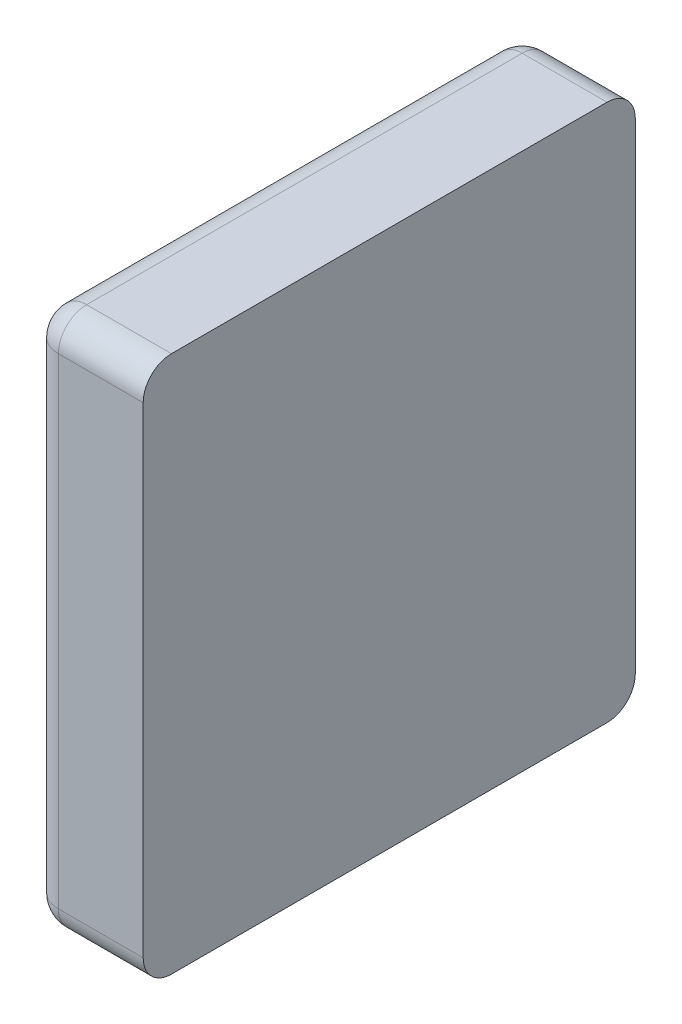
ISO-10303-21;
HEADER;
FILE_DESCRIPTION(('STEP AP214'),'2;1');
FILE_NAME('part.step','',(''),(''),'','','');
FILE_SCHEMA(('AUTOMOTIVE_DESIGN { 1 0 10303 214 1 1 1 1 }'));
ENDSEC;
DATA;
#1=APPLICATION_CONTEXT('core data for automotive mechanical design processes');
#2=APPLICATION_PROTOCOL_DEFINITION('international standard','automotive_design',2000,#1);
#3=PRODUCT_CONTEXT('',#1,'mechanical');
#4=PRODUCT('Part','Part','',(#3));
#5=PRODUCT_RELATED_PRODUCT_CATEGORY('part','',(#4));
#6=PRODUCT_DEFINITION_FORMATION('','',#4);
#7=PRODUCT_DEFINITION_CONTEXT('part definition',#1,'design');
#8=PRODUCT_DEFINITION('design','',#6,#7);
#9=PRODUCT_DEFINITION_SHAPE('','',#8);
#10=(LENGTH_UNIT() NAMED_UNIT(*) SI_UNIT(.MILLI.,.METRE.));
#11=(NAMED_UNIT(*) PLANE_ANGLE_UNIT() SI_UNIT($,.RADIAN.));
#12=(NAMED_UNIT(*) SI_UNIT($,.STERADIAN.) SOLID_ANGLE_UNIT());
#13=UNCERTAINTY_MEASURE_WITH_UNIT(LENGTH_MEASURE(1.E-05),#10,'distance_accuracy_value','');
#14=(GEOMETRIC_REPRESENTATION_CONTEXT(3) GLOBAL_UNCERTAINTY_ASSIGNED_CONTEXT((#13)) GLOBAL_UNIT_ASSIGNED_CONTEXT((#10,
#11,#12)) REPRESENTATION_CONTEXT('',''));
#15=CARTESIAN_POINT('',(0.,0.,0.));
#16=DIRECTION('',(0.,0.,1.));
#17=DIRECTION('',(1.,0.,0.));
#18=AXIS2_PLACEMENT_3D('',#15,#16,#17);
#19=CARTESIAN_POINT('',(0.,0.,0.));
#20=DIRECTION('',(1.,0.,0.));
#21=DIRECTION('',(0.,1.,0.));
#22=AXIS2_PLACEMENT_3D('',#19,#20,#21);
#23=PLANE('',#22);
#24=DIRECTION('',(0.,1.,0.));
#25=VECTOR('',#24,1.);
#26=CARTESIAN_POINT('',(0.,0.,0.82));
#27=LINE('',#26,#25);
#28=CARTESIAN_POINT('',(0.,0.05,0.82));
#29=VERTEX_POINT('',#28);
#30=CARTESIAN_POINT('',(0.,0.9,0.82));
#31=VERTEX_POINT('',#30);
#32=EDGE_CURVE('E11',#29,#31,#27,.T.);
#33=ORIENTED_EDGE('',*,*,#32,.T.);
#34=DIRECTION('',(0.,0.,1.));
#35=VECTOR('',#34,1.);
#36=CARTESIAN_POINT('',(0.,0.9,0.));
#37=LINE('',#36,#35);
#38=CARTESIAN_POINT('',(0.,0.9,0.05));
#39=VERTEX_POINT('',#38);
#40=EDGE_CURVE('E135',#39,#31,#37,.T.);
#41=ORIENTED_EDGE('',*,*,#40,.F.);
#42=DIRECTION('',(0.,1.,0.));
#43=VECTOR('',#42,1.);
#44=CARTESIAN_POINT('',(0.,0.,0.05));
#45=LINE('',#44,#43);
#46=CARTESIAN_POINT('',(0.,0.05,0.05));
#47=VERTEX_POINT('',#46);
#48=EDGE_CURVE('E191',#47,#39,#45,.T.);
#49=ORIENTED_EDGE('',*,*,#48,.F.);
#50=DIRECTION('',(0.,0.,1.));
#51=VECTOR('',#50,1.);
#52=CARTESIAN_POINT('',(0.,0.05,0.));
#53=LINE('',#52,#51);
#54=EDGE_CURVE('E27',#47,#29,#53,.T.);
#55=ORIENTED_EDGE('',*,*,#54,.T.);
#56=EDGE_LOOP('',(#33,#41,#49,#55));
#57=FACE_BOUND('',#56,.T.);
#58=ADVANCED_FACE('F17',(#57),#23,.F.);
#59=CARTESIAN_POINT('',(0.05,0.05,0.));
#60=DIRECTION('',(0.,0.,1.));
#61=DIRECTION('',(-1.,0.,0.));
#62=AXIS2_PLACEMENT_3D('',#59,#60,#61);
#63=CYLINDRICAL_SURFACE('',#62,0.05);
#64=ORIENTED_EDGE('',*,*,#54,.F.);
#65=CARTESIAN_POINT('',(0.05,0.05,0.05));
#66=DIRECTION('',(0.,0.,1.));
#67=DIRECTION('',(-1.,0.,0.));
#68=AXIS2_PLACEMENT_3D('',#65,#66,#67);
#69=CIRCLE('',#68,0.05);
#70=CARTESIAN_POINT('',(0.05,0.,0.05));
#71=VERTEX_POINT('',#70);
#72=EDGE_CURVE('E171',#47,#71,#69,.T.);
#73=ORIENTED_EDGE('',*,*,#72,.T.);
#74=DIRECTION('',(0.,0.,1.));
#75=VECTOR('',#74,1.);
#76=CARTESIAN_POINT('',(0.05,0.,0.));
#77=LINE('',#76,#75);
#78=CARTESIAN_POINT('',(0.05,0.,0.82));
#79=VERTEX_POINT('',#78);
#80=EDGE_CURVE('E194',#71,#79,#77,.T.);
#81=ORIENTED_EDGE('',*,*,#80,.T.);
#82=CARTESIAN_POINT('',(0.05,0.05,0.82));
#83=DIRECTION('',(0.,0.,1.));
#84=DIRECTION('',(-1.,0.,0.));
#85=AXIS2_PLACEMENT_3D('',#82,#83,#84);
#86=CIRCLE('',#85,0.05);
#87=EDGE_CURVE('E110',#29,#79,#86,.T.);
#88=ORIENTED_EDGE('',*,*,#87,.F.);
#89=EDGE_LOOP('',(#64,#73,#81,#88));
#90=FACE_BOUND('',#89,.T.);
#91=ADVANCED_FACE('F19',(#90),#63,.T.);
#92=CARTESIAN_POINT('',(0.05,0.,0.05));
#93=DIRECTION('',(0.,1.,0.));
#94=DIRECTION('',(-1.,0.,0.));
#95=AXIS2_PLACEMENT_3D('',#92,#93,#94);
#96=CYLINDRICAL_SURFACE('',#95,0.05);
#97=ORIENTED_EDGE('',*,*,#48,.T.);
#98=CARTESIAN_POINT('',(0.05,0.9,0.05));
#99=DIRECTION('',(0.,1.,0.));
#100=DIRECTION('',(-1.,0.,0.));
#101=AXIS2_PLACEMENT_3D('',#98,#99,#100);
#102=CIRCLE('',#101,0.05);
#103=CARTESIAN_POINT('',(0.05,0.9,0.));
#104=VERTEX_POINT('',#103);
#105=EDGE_CURVE('E141',#104,#39,#102,.T.);
#106=ORIENTED_EDGE('',*,*,#105,.F.);
#107=DIRECTION('',(0.,1.,0.));
#108=VECTOR('',#107,1.);
#109=CARTESIAN_POINT('',(0.05,0.,0.));
#110=LINE('',#109,#108);
#111=CARTESIAN_POINT('',(0.05,0.05,0.));
#112=VERTEX_POINT('',#111);
#113=EDGE_CURVE('E172',#112,#104,#110,.T.);
#114=ORIENTED_EDGE('',*,*,#113,.F.);
#115=CARTESIAN_POINT('',(0.05,0.05,0.05));
#116=DIRECTION('',(0.,1.,0.));
#117=DIRECTION('',(-1.,0.,0.));
#118=AXIS2_PLACEMENT_3D('',#115,#116,#117);
#119=CIRCLE('',#118,0.05);
#120=EDGE_CURVE('E134',#112,#47,#119,.T.);
#121=ORIENTED_EDGE('',*,*,#120,.T.);
#122=EDGE_LOOP('',(#97,#106,#114,#121));
#123=FACE_BOUND('',#122,.T.);
#124=ADVANCED_FACE('F269',(#123),#96,.T.);
#125=CARTESIAN_POINT('',(0.05,0.,0.82));
#126=DIRECTION('',(0.,1.,0.));
#127=DIRECTION('',(-1.,0.,0.));
#128=AXIS2_PLACEMENT_3D('',#125,#126,#127);
#129=CYLINDRICAL_SURFACE('',#128,0.05);
#130=CARTESIAN_POINT('',(0.05,0.05,0.82));
#131=DIRECTION('',(0.,-1.,0.));
#132=DIRECTION('',(-1.,0.,0.));
#133=AXIS2_PLACEMENT_3D('',#130,#131,#132);
#134=CIRCLE('',#133,0.05);
#135=CARTESIAN_POINT('',(0.05,0.05,0.87));
#136=VERTEX_POINT('',#135);
#137=EDGE_CURVE('E109',#136,#29,#134,.T.);
#138=ORIENTED_EDGE('',*,*,#137,.F.);
#139=DIRECTION('',(0.,1.,0.));
#140=VECTOR('',#139,1.);
#141=CARTESIAN_POINT('',(0.05,0.,0.87));
#142=LINE('',#141,#140);
#143=CARTESIAN_POINT('',(0.05,0.9,0.87));
#144=VERTEX_POINT('',#143);
#145=EDGE_CURVE('E121',#136,#144,#142,.T.);
#146=ORIENTED_EDGE('',*,*,#145,.T.);
#147=CARTESIAN_POINT('',(0.05,0.9,0.82));
#148=DIRECTION('',(0.,1.,0.));
#149=DIRECTION('',(-1.,0.,0.));
#150=AXIS2_PLACEMENT_3D('',#147,#148,#149);
#151=CIRCLE('',#150,0.05);
#152=EDGE_CURVE('E40',#31,#144,#151,.T.);
#153=ORIENTED_EDGE('',*,*,#152,.F.);
#154=ORIENTED_EDGE('',*,*,#32,.F.);
#155=EDGE_LOOP('',(#138,#146,#153,#154));
#156=FACE_BOUND('',#155,.T.);
#157=ADVANCED_FACE('F120',(#156),#129,.T.);
#158=CARTESIAN_POINT('',(0.05,0.9,0.));
#159=DIRECTION('',(0.,0.,1.));
#160=DIRECTION('',(-1.,0.,0.));
#161=AXIS2_PLACEMENT_3D('',#158,#159,#160);
#162=CYLINDRICAL_SURFACE('',#161,0.05);
#163=CARTESIAN_POINT('',(0.05,0.9,0.82));
#164=DIRECTION('',(0.,0.,1.));
#165=DIRECTION('',(-1.,0.,0.));
#166=AXIS2_PLACEMENT_3D('',#163,#164,#165);
#167=CIRCLE('',#166,0.05);
#168=CARTESIAN_POINT('',(0.05,0.95,0.82));
#169=VERTEX_POINT('',#168);
#170=EDGE_CURVE('E164',#169,#31,#167,.T.);
#171=ORIENTED_EDGE('',*,*,#170,.F.);
#172=DIRECTION('',(0.,0.,1.));
#173=VECTOR('',#172,1.);
#174=CARTESIAN_POINT('',(0.05,0.95,0.));
#175=LINE('',#174,#173);
#176=CARTESIAN_POINT('',(0.05,0.95,0.05));
#177=VERTEX_POINT('',#176);
#178=EDGE_CURVE('E183',#177,#169,#175,.T.);
#179=ORIENTED_EDGE('',*,*,#178,.F.);
#180=CARTESIAN_POINT('',(0.05,0.9,0.05));
#181=DIRECTION('',(0.,0.,-1.));
#182=DIRECTION('',(-1.,0.,0.));
#183=AXIS2_PLACEMENT_3D('',#180,#181,#182);
#184=CIRCLE('',#183,0.05);
#185=EDGE_CURVE('E147',#39,#177,#184,.T.);
#186=ORIENTED_EDGE('',*,*,#185,.F.);
#187=ORIENTED_EDGE('',*,*,#40,.T.);
#188=EDGE_LOOP('',(#171,#179,#186,#187));
#189=FACE_BOUND('',#188,.T.);
#190=ADVANCED_FACE('F306',(#189),#162,.T.);
#191=CARTESIAN_POINT('',(0.05,0.05,0.05));
#192=DIRECTION('',(0.,0.,1.));
#193=DIRECTION('',(-1.,0.,0.));
#194=AXIS2_PLACEMENT_3D('',#191,#192,#193);
#195=SPHERICAL_SURFACE('',#194,0.05);
#196=ORIENTED_EDGE('',*,*,#120,.F.);
#197=CARTESIAN_POINT('',(0.05,0.05,0.05));
#198=DIRECTION('',(-1.,0.,0.));
#199=DIRECTION('',(0.,-1.,0.));
#200=AXIS2_PLACEMENT_3D('',#197,#198,#199);
#201=CIRCLE('',#200,0.05);
#202=EDGE_CURVE('E167',#112,#71,#201,.T.);
#203=ORIENTED_EDGE('',*,*,#202,.T.);
#204=ORIENTED_EDGE('',*,*,#72,.F.);
#205=EDGE_LOOP('',(#196,#203,#204));
#206=FACE_BOUND('',#205,.T.);
#207=ADVANCED_FACE('F264',(#206),#195,.T.);
#208=CARTESIAN_POINT('',(0.05,0.05,0.82));
#209=DIRECTION('',(0.,0.,-1.));
#210=DIRECTION('',(-1.,0.,0.));
#211=AXIS2_PLACEMENT_3D('',#208,#209,#210);
#212=SPHERICAL_SURFACE('',#211,0.05);
#213=ORIENTED_EDGE('',*,*,#87,.T.);
#214=CARTESIAN_POINT('',(0.05,0.05,0.82));
#215=DIRECTION('',(1.,0.,0.));
#216=DIRECTION('',(0.,-1.,0.));
#217=AXIS2_PLACEMENT_3D('',#214,#215,#216);
#218=CIRCLE('',#217,0.05);
#219=EDGE_CURVE('E106',#136,#79,#218,.T.);
#220=ORIENTED_EDGE('',*,*,#219,.F.);
#221=ORIENTED_EDGE('',*,*,#137,.T.);
#222=EDGE_LOOP('',(#213,#220,#221));
#223=FACE_BOUND('',#222,.T.);
#224=ADVANCED_FACE('F108',(#223),#212,.T.);
#225=CARTESIAN_POINT('',(0.,0.,0.));
#226=DIRECTION('',(0.,1.,0.));
#227=DIRECTION('',(1.,0.,0.));
#228=AXIS2_PLACEMENT_3D('',#225,#226,#227);
#229=PLANE('',#228);
#230=DIRECTION('',(0.,0.,1.));
#231=VECTOR('',#230,1.);
#232=CARTESIAN_POINT('',(0.2,0.,0.));
#233=LINE('',#232,#231);
#234=CARTESIAN_POINT('',(0.2,0.,0.05));
#235=VERTEX_POINT('',#234);
#236=CARTESIAN_POINT('',(0.2,0.,0.82));
#237=VERTEX_POINT('',#236);
#238=EDGE_CURVE('E124',#235,#237,#233,.T.);
#239=ORIENTED_EDGE('',*,*,#238,.T.);
#240=DIRECTION('',(1.,0.,0.));
#241=VECTOR('',#240,1.);
#242=CARTESIAN_POINT('',(0.,0.,0.82));
#243=LINE('',#242,#241);
#244=EDGE_CURVE('E116',#79,#237,#243,.T.);
#245=ORIENTED_EDGE('',*,*,#244,.F.);
#246=ORIENTED_EDGE('',*,*,#80,.F.);
#247=DIRECTION('',(1.,0.,0.));
#248=VECTOR('',#247,1.);
#249=CARTESIAN_POINT('',(0.,0.,0.05));
#250=LINE('',#249,#248);
#251=EDGE_CURVE('E203',#71,#235,#250,.T.);
#252=ORIENTED_EDGE('',*,*,#251,.T.);
#253=EDGE_LOOP('',(#239,#245,#246,#252));
#254=FACE_BOUND('',#253,.T.);
#255=ADVANCED_FACE('F222',(#254),#229,.F.);
#256=CARTESIAN_POINT('',(0.,0.,0.));
#257=DIRECTION('',(0.,0.,1.));
#258=DIRECTION('',(1.,0.,0.));
#259=AXIS2_PLACEMENT_3D('',#256,#257,#258);
#260=PLANE('',#259);
#261=DIRECTION('',(1.,0.,0.));
#262=VECTOR('',#261,1.);
#263=CARTESIAN_POINT('',(0.,0.9,0.));
#264=LINE('',#263,#262);
#265=CARTESIAN_POINT('',(0.2,0.9,0.));
#266=VERTEX_POINT('',#265);
#267=EDGE_CURVE('E175',#104,#266,#264,.T.);
#268=ORIENTED_EDGE('',*,*,#267,.T.);
#269=DIRECTION('',(0.,1.,0.));
#270=VECTOR('',#269,1.);
#271=CARTESIAN_POINT('',(0.2,0.,0.));
#272=LINE('',#271,#270);
#273=CARTESIAN_POINT('',(0.2,0.05,0.));
#274=VERTEX_POINT('',#273);
#275=EDGE_CURVE('E71',#274,#266,#272,.T.);
#276=ORIENTED_EDGE('',*,*,#275,.F.);
#277=DIRECTION('',(1.,0.,0.));
#278=VECTOR('',#277,1.);
#279=CARTESIAN_POINT('',(0.,0.05,0.));
#280=LINE('',#279,#278);
#281=EDGE_CURVE('E177',#112,#274,#280,.T.);
#282=ORIENTED_EDGE('',*,*,#281,.F.);
#283=ORIENTED_EDGE('',*,*,#113,.T.);
#284=EDGE_LOOP('',(#268,#276,#282,#283));
#285=FACE_BOUND('',#284,.T.);
#286=ADVANCED_FACE('F273',(#285),#260,.F.);
#287=CARTESIAN_POINT('',(0.05,0.9,0.05));
#288=DIRECTION('',(0.,0.,1.));
#289=DIRECTION('',(-1.,0.,0.));
#290=AXIS2_PLACEMENT_3D('',#287,#288,#289);
#291=SPHERICAL_SURFACE('',#290,0.05);
#292=ORIENTED_EDGE('',*,*,#185,.T.);
#293=CARTESIAN_POINT('',(0.05,0.9,0.05));
#294=DIRECTION('',(1.,0.,0.));
#295=DIRECTION('',(0.,1.,0.));
#296=AXIS2_PLACEMENT_3D('',#293,#294,#295);
#297=CIRCLE('',#296,0.05);
#298=EDGE_CURVE('E152',#104,#177,#297,.T.);
#299=ORIENTED_EDGE('',*,*,#298,.F.);
#300=ORIENTED_EDGE('',*,*,#105,.T.);
#301=EDGE_LOOP('',(#292,#299,#300));
#302=FACE_BOUND('',#301,.T.);
#303=ADVANCED_FACE('F276',(#302),#291,.T.);
#304=CARTESIAN_POINT('',(0.,0.,0.87));
#305=DIRECTION('',(0.,0.,1.));
#306=DIRECTION('',(1.,0.,0.));
#307=AXIS2_PLACEMENT_3D('',#304,#305,#306);
#308=PLANE('',#307);
#309=ORIENTED_EDGE('',*,*,#145,.F.);
#310=DIRECTION('',(1.,0.,0.));
#311=VECTOR('',#310,1.);
#312=CARTESIAN_POINT('',(0.,0.05,0.87));
#313=LINE('',#312,#311);
#314=CARTESIAN_POINT('',(0.2,0.05,0.87));
#315=VERTEX_POINT('',#314);
#316=EDGE_CURVE('E130',#136,#315,#313,.T.);
#317=ORIENTED_EDGE('',*,*,#316,.T.);
#318=DIRECTION('',(0.,1.,0.));
#319=VECTOR('',#318,1.);
#320=CARTESIAN_POINT('',(0.2,0.,0.87));
#321=LINE('',#320,#319);
#322=CARTESIAN_POINT('',(0.2,0.9,0.87));
#323=VERTEX_POINT('',#322);
#324=EDGE_CURVE('E142',#315,#323,#321,.T.);
#325=ORIENTED_EDGE('',*,*,#324,.T.);
#326=DIRECTION('',(1.,0.,0.));
#327=VECTOR('',#326,1.);
#328=CARTESIAN_POINT('',(0.,0.9,0.87));
#329=LINE('',#328,#327);
#330=EDGE_CURVE('E132',#144,#323,#329,.T.);
#331=ORIENTED_EDGE('',*,*,#330,.F.);
#332=EDGE_LOOP('',(#309,#317,#325,#331));
#333=FACE_BOUND('',#332,.T.);
#334=ADVANCED_FACE('F128',(#333),#308,.T.);
#335=CARTESIAN_POINT('',(0.05,0.9,0.82));
#336=DIRECTION('',(0.,-1.,0.));
#337=DIRECTION('',(-1.,0.,0.));
#338=AXIS2_PLACEMENT_3D('',#335,#336,#337);
#339=SPHERICAL_SURFACE('',#338,0.05);
#340=ORIENTED_EDGE('',*,*,#152,.T.);
#341=CARTESIAN_POINT('',(0.05,0.9,0.82));
#342=DIRECTION('',(1.,0.,0.));
#343=DIRECTION('',(0.,0.,1.));
#344=AXIS2_PLACEMENT_3D('',#341,#342,#343);
#345=CIRCLE('',#344,0.05);
#346=EDGE_CURVE('E187',#169,#144,#345,.T.);
#347=ORIENTED_EDGE('',*,*,#346,.F.);
#348=ORIENTED_EDGE('',*,*,#170,.T.);
#349=EDGE_LOOP('',(#340,#347,#348));
#350=FACE_BOUND('',#349,.T.);
#351=ADVANCED_FACE('F293',(#350),#339,.T.);
#352=CARTESIAN_POINT('',(0.,0.95,0.));
#353=DIRECTION('',(0.,1.,0.));
#354=DIRECTION('',(1.,0.,0.));
#355=AXIS2_PLACEMENT_3D('',#352,#353,#354);
#356=PLANE('',#355);
#357=DIRECTION('',(1.,0.,0.));
#358=VECTOR('',#357,1.);
#359=CARTESIAN_POINT('',(0.,0.95,0.05));
#360=LINE('',#359,#358);
#361=CARTESIAN_POINT('',(0.2,0.95,0.05));
#362=VERTEX_POINT('',#361);
#363=EDGE_CURVE('E158',#177,#362,#360,.T.);
#364=ORIENTED_EDGE('',*,*,#363,.F.);
#365=ORIENTED_EDGE('',*,*,#178,.T.);
#366=DIRECTION('',(1.,0.,0.));
#367=VECTOR('',#366,1.);
#368=CARTESIAN_POINT('',(0.,0.95,0.82));
#369=LINE('',#368,#367);
#370=CARTESIAN_POINT('',(0.2,0.95,0.82));
#371=VERTEX_POINT('',#370);
#372=EDGE_CURVE('E180',#169,#371,#369,.T.);
#373=ORIENTED_EDGE('',*,*,#372,.T.);
#374=DIRECTION('',(0.,0.,1.));
#375=VECTOR('',#374,1.);
#376=CARTESIAN_POINT('',(0.2,0.95,0.));
#377=LINE('',#376,#375);
#378=EDGE_CURVE('E157',#362,#371,#377,.T.);
#379=ORIENTED_EDGE('',*,*,#378,.F.);
#380=EDGE_LOOP('',(#364,#365,#373,#379));
#381=FACE_BOUND('',#380,.T.);
#382=ADVANCED_FACE('F296',(#381),#356,.T.);
#383=CARTESIAN_POINT('',(0.,0.05,0.05));
#384=DIRECTION('',(1.,0.,0.));
#385=DIRECTION('',(0.,-1.,0.));
#386=AXIS2_PLACEMENT_3D('',#383,#384,#385);
#387=CYLINDRICAL_SURFACE('',#386,0.05);
#388=ORIENTED_EDGE('',*,*,#202,.F.);
#389=ORIENTED_EDGE('',*,*,#281,.T.);
#390=CARTESIAN_POINT('',(0.2,0.05,0.05));
#391=DIRECTION('',(1.,0.,0.));
#392=DIRECTION('',(0.,-1.,0.));
#393=AXIS2_PLACEMENT_3D('',#390,#391,#392);
#394=CIRCLE('',#393,0.05);
#395=EDGE_CURVE('E117',#235,#274,#394,.T.);
#396=ORIENTED_EDGE('',*,*,#395,.F.);
#397=ORIENTED_EDGE('',*,*,#251,.F.);
#398=EDGE_LOOP('',(#388,#389,#396,#397));
#399=FACE_BOUND('',#398,.T.);
#400=ADVANCED_FACE('F272',(#399),#387,.T.);
#401=CARTESIAN_POINT('',(0.,0.05,0.82));
#402=DIRECTION('',(1.,0.,0.));
#403=DIRECTION('',(0.,-1.,0.));
#404=AXIS2_PLACEMENT_3D('',#401,#402,#403);
#405=CYLINDRICAL_SURFACE('',#404,0.05);
#406=ORIENTED_EDGE('',*,*,#244,.T.);
#407=CARTESIAN_POINT('',(0.2,0.05,0.82));
#408=DIRECTION('',(1.,0.,0.));
#409=DIRECTION('',(0.,-1.,0.));
#410=AXIS2_PLACEMENT_3D('',#407,#408,#409);
#411=CIRCLE('',#410,0.05);
#412=EDGE_CURVE('E139',#315,#237,#411,.T.);
#413=ORIENTED_EDGE('',*,*,#412,.F.);
#414=ORIENTED_EDGE('',*,*,#316,.F.);
#415=ORIENTED_EDGE('',*,*,#219,.T.);
#416=EDGE_LOOP('',(#406,#413,#414,#415));
#417=FACE_BOUND('',#416,.T.);
#418=ADVANCED_FACE('F137',(#417),#405,.T.);
#419=CARTESIAN_POINT('',(0.2,0.,0.));
#420=DIRECTION('',(1.,0.,0.));
#421=DIRECTION('',(0.,1.,0.));
#422=AXIS2_PLACEMENT_3D('',#419,#420,#421);
#423=PLANE('',#422);
#424=ORIENTED_EDGE('',*,*,#238,.F.);
#425=ORIENTED_EDGE('',*,*,#395,.T.);
#426=ORIENTED_EDGE('',*,*,#275,.T.);
#427=CARTESIAN_POINT('',(0.2,0.9,0.05));
#428=DIRECTION('',(1.,0.,0.));
#429=DIRECTION('',(0.,1.,0.));
#430=AXIS2_PLACEMENT_3D('',#427,#428,#429);
#431=CIRCLE('',#430,0.05);
#432=EDGE_CURVE('E154',#266,#362,#431,.T.);
#433=ORIENTED_EDGE('',*,*,#432,.T.);
#434=ORIENTED_EDGE('',*,*,#378,.T.);
#435=CARTESIAN_POINT('',(0.2,0.9,0.82));
#436=DIRECTION('',(1.,0.,0.));
#437=DIRECTION('',(0.,1.,0.));
#438=AXIS2_PLACEMENT_3D('',#435,#436,#437);
#439=CIRCLE('',#438,0.05);
#440=EDGE_CURVE('E199',#371,#323,#439,.T.);
#441=ORIENTED_EDGE('',*,*,#440,.T.);
#442=ORIENTED_EDGE('',*,*,#324,.F.);
#443=ORIENTED_EDGE('',*,*,#412,.T.);
#444=EDGE_LOOP('',(#424,#425,#426,#433,#434,#441,#442,#443));
#445=FACE_BOUND('',#444,.T.);
#446=ADVANCED_FACE('F228',(#445),#423,.T.);
#447=CARTESIAN_POINT('',(0.,0.9,0.05));
#448=DIRECTION('',(1.,0.,0.));
#449=DIRECTION('',(0.,1.,0.));
#450=AXIS2_PLACEMENT_3D('',#447,#448,#449);
#451=CYLINDRICAL_SURFACE('',#450,0.05);
#452=ORIENTED_EDGE('',*,*,#363,.T.);
#453=ORIENTED_EDGE('',*,*,#432,.F.);
#454=ORIENTED_EDGE('',*,*,#267,.F.);
#455=ORIENTED_EDGE('',*,*,#298,.T.);
#456=EDGE_LOOP('',(#452,#453,#454,#455));
#457=FACE_BOUND('',#456,.T.);
#458=ADVANCED_FACE('F300',(#457),#451,.T.);
#459=CARTESIAN_POINT('',(0.,0.9,0.82));
#460=DIRECTION('',(1.,0.,0.));
#461=DIRECTION('',(0.,1.,0.));
#462=AXIS2_PLACEMENT_3D('',#459,#460,#461);
#463=CYLINDRICAL_SURFACE('',#462,0.05);
#464=ORIENTED_EDGE('',*,*,#372,.F.);
#465=ORIENTED_EDGE('',*,*,#346,.T.);
#466=ORIENTED_EDGE('',*,*,#330,.T.);
#467=ORIENTED_EDGE('',*,*,#440,.F.);
#468=EDGE_LOOP('',(#464,#465,#466,#467));
#469=FACE_BOUND('',#468,.T.);
#470=ADVANCED_FACE('F234',(#469),#463,.T.);
#471=CLOSED_SHELL('',(#58,#91,#124,#157,#190,#207,#224,#255,#286,#303,#334,#351,#382,#400,#418,
#446,#458,#470));
#472=MANIFOLD_SOLID_BREP('B1',#471);
#473=ADVANCED_BREP_SHAPE_REPRESENTATION('',(#18,#472),#14);
#474=SHAPE_DEFINITION_REPRESENTATION(#9,#473);
ENDSEC;
END-ISO-10303-21;
